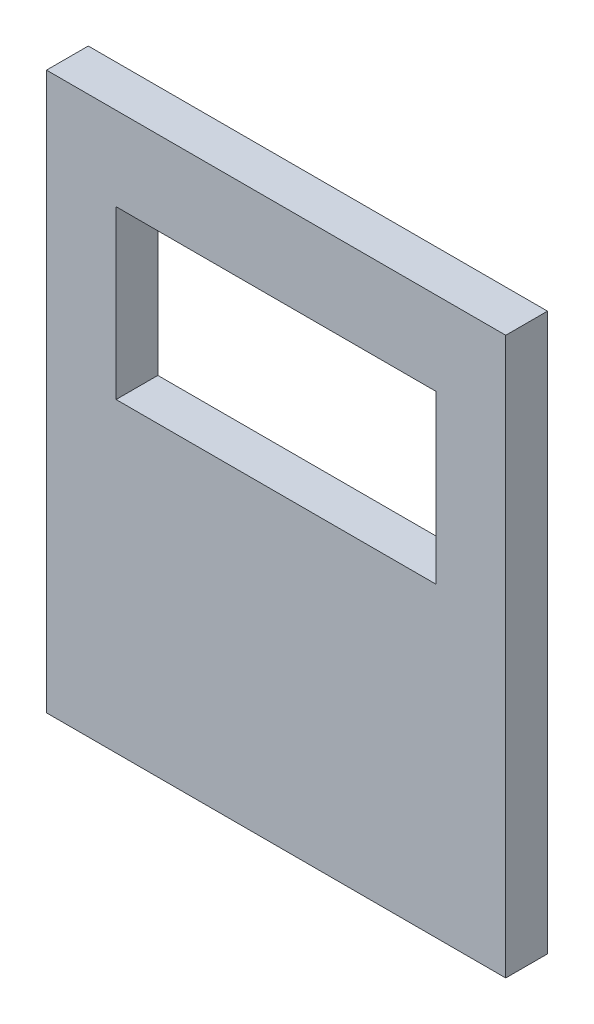
ISO-10303-21;
HEADER;
FILE_DESCRIPTION(('STEP AP214'),'2;1');
FILE_NAME('part.step','',(''),(''),'','','');
FILE_SCHEMA(('AUTOMOTIVE_DESIGN { 1 0 10303 214 1 1 1 1 }'));
ENDSEC;
DATA;
#1=APPLICATION_CONTEXT('core data for automotive mechanical design processes');
#2=APPLICATION_PROTOCOL_DEFINITION('international standard','automotive_design',2000,#1);
#3=PRODUCT_CONTEXT('',#1,'mechanical');
#4=PRODUCT('Part','Part','',(#3));
#5=PRODUCT_RELATED_PRODUCT_CATEGORY('part','',(#4));
#6=PRODUCT_DEFINITION_FORMATION('','',#4);
#7=PRODUCT_DEFINITION_CONTEXT('part definition',#1,'design');
#8=PRODUCT_DEFINITION('design','',#6,#7);
#9=PRODUCT_DEFINITION_SHAPE('','',#8);
#10=(LENGTH_UNIT() NAMED_UNIT(*) SI_UNIT(.MILLI.,.METRE.));
#11=(NAMED_UNIT(*) PLANE_ANGLE_UNIT() SI_UNIT($,.RADIAN.));
#12=(NAMED_UNIT(*) SI_UNIT($,.STERADIAN.) SOLID_ANGLE_UNIT());
#13=UNCERTAINTY_MEASURE_WITH_UNIT(LENGTH_MEASURE(1.E-05),#10,'distance_accuracy_value','');
#14=(GEOMETRIC_REPRESENTATION_CONTEXT(3) GLOBAL_UNCERTAINTY_ASSIGNED_CONTEXT((#13)) GLOBAL_UNIT_ASSIGNED_CONTEXT((#10,
#11,#12)) REPRESENTATION_CONTEXT('',''));
#15=CARTESIAN_POINT('',(0.,0.,0.));
#16=DIRECTION('',(0.,0.,1.));
#17=DIRECTION('',(1.,0.,0.));
#18=AXIS2_PLACEMENT_3D('',#15,#16,#17);
#19=CARTESIAN_POINT('',(0.,0.,3.));
#20=DIRECTION('',(0.,0.,-1.));
#21=DIRECTION('',(-1.,0.,0.));
#22=AXIS2_PLACEMENT_3D('',#19,#20,#21);
#23=PLANE('',#22);
#24=DIRECTION('',(0.,1.,0.));
#25=VECTOR('',#24,1.);
#26=CARTESIAN_POINT('',(16.5,-20.,3.));
#27=LINE('',#26,#25);
#28=CARTESIAN_POINT('',(16.5,-20.,3.));
#29=VERTEX_POINT('',#28);
#30=CARTESIAN_POINT('',(16.5,20.,3.));
#31=VERTEX_POINT('',#30);
#32=EDGE_CURVE('E134',#29,#31,#27,.T.);
#33=ORIENTED_EDGE('',*,*,#32,.T.);
#34=DIRECTION('',(-1.,0.,0.));
#35=VECTOR('',#34,1.);
#36=CARTESIAN_POINT('',(-16.5,20.,3.));
#37=LINE('',#36,#35);
#38=CARTESIAN_POINT('',(-16.5,20.,3.));
#39=VERTEX_POINT('',#38);
#40=EDGE_CURVE('E137',#31,#39,#37,.T.);
#41=ORIENTED_EDGE('',*,*,#40,.T.);
#42=DIRECTION('',(0.,-1.,0.));
#43=VECTOR('',#42,1.);
#44=CARTESIAN_POINT('',(-16.5,-20.,3.));
#45=LINE('',#44,#43);
#46=CARTESIAN_POINT('',(-16.5,-20.,3.));
#47=VERTEX_POINT('',#46);
#48=EDGE_CURVE('E140',#39,#47,#45,.T.);
#49=ORIENTED_EDGE('',*,*,#48,.T.);
#50=DIRECTION('',(1.,0.,0.));
#51=VECTOR('',#50,1.);
#52=CARTESIAN_POINT('',(-16.5,-20.,3.));
#53=LINE('',#52,#51);
#54=EDGE_CURVE('E142',#47,#29,#53,.T.);
#55=ORIENTED_EDGE('',*,*,#54,.T.);
#56=EDGE_LOOP('',(#33,#41,#49,#55));
#57=FACE_BOUND('',#56,.T.);
#58=DIRECTION('',(0.,-1.,0.));
#59=VECTOR('',#58,1.);
#60=CARTESIAN_POINT('',(-11.5,14.,3.));
#61=LINE('',#60,#59);
#62=CARTESIAN_POINT('',(-11.5,14.,3.));
#63=VERTEX_POINT('',#62);
#64=CARTESIAN_POINT('',(-11.5,1.99999999999999,3.));
#65=VERTEX_POINT('',#64);
#66=EDGE_CURVE('E98',#63,#65,#61,.T.);
#67=ORIENTED_EDGE('',*,*,#66,.F.);
#68=DIRECTION('',(-1.,0.,0.));
#69=VECTOR('',#68,1.);
#70=CARTESIAN_POINT('',(-11.5,14.,3.));
#71=LINE('',#70,#69);
#72=CARTESIAN_POINT('',(11.5,14.,3.));
#73=VERTEX_POINT('',#72);
#74=EDGE_CURVE('E120',#73,#63,#71,.T.);
#75=ORIENTED_EDGE('',*,*,#74,.F.);
#76=DIRECTION('',(0.,1.,0.));
#77=VECTOR('',#76,1.);
#78=CARTESIAN_POINT('',(11.5,14.,3.));
#79=LINE('',#78,#77);
#80=CARTESIAN_POINT('',(11.5,1.99999999999999,3.));
#81=VERTEX_POINT('',#80);
#82=EDGE_CURVE('E118',#81,#73,#79,.T.);
#83=ORIENTED_EDGE('',*,*,#82,.F.);
#84=DIRECTION('',(1.,0.,0.));
#85=VECTOR('',#84,1.);
#86=CARTESIAN_POINT('',(-11.5,1.99999999999999,3.));
#87=LINE('',#86,#85);
#88=EDGE_CURVE('E106',#65,#81,#87,.T.);
#89=ORIENTED_EDGE('',*,*,#88,.F.);
#90=EDGE_LOOP('',(#67,#75,#83,#89));
#91=FACE_BOUND('',#90,.T.);
#92=ADVANCED_FACE('F33',(#57,#91),#23,.F.);
#93=CARTESIAN_POINT('',(0.,0.,0.));
#94=DIRECTION('',(0.,0.,-1.));
#95=DIRECTION('',(-1.,0.,0.));
#96=AXIS2_PLACEMENT_3D('',#93,#94,#95);
#97=PLANE('',#96);
#98=DIRECTION('',(0.,1.,0.));
#99=VECTOR('',#98,1.);
#100=CARTESIAN_POINT('',(16.5,-20.,0.));
#101=LINE('',#100,#99);
#102=CARTESIAN_POINT('',(16.5,-20.,0.));
#103=VERTEX_POINT('',#102);
#104=CARTESIAN_POINT('',(16.5,20.,0.));
#105=VERTEX_POINT('',#104);
#106=EDGE_CURVE('E114',#103,#105,#101,.T.);
#107=ORIENTED_EDGE('',*,*,#106,.F.);
#108=DIRECTION('',(1.,0.,0.));
#109=VECTOR('',#108,1.);
#110=CARTESIAN_POINT('',(-16.5,-20.,0.));
#111=LINE('',#110,#109);
#112=CARTESIAN_POINT('',(-16.5,-20.,0.));
#113=VERTEX_POINT('',#112);
#114=EDGE_CURVE('E138',#113,#103,#111,.T.);
#115=ORIENTED_EDGE('',*,*,#114,.F.);
#116=DIRECTION('',(0.,-1.,0.));
#117=VECTOR('',#116,1.);
#118=CARTESIAN_POINT('',(-16.5,-20.,0.));
#119=LINE('',#118,#117);
#120=CARTESIAN_POINT('',(-16.5,20.,0.));
#121=VERTEX_POINT('',#120);
#122=EDGE_CURVE('E149',#121,#113,#119,.T.);
#123=ORIENTED_EDGE('',*,*,#122,.F.);
#124=DIRECTION('',(-1.,0.,0.));
#125=VECTOR('',#124,1.);
#126=CARTESIAN_POINT('',(-16.5,20.,0.));
#127=LINE('',#126,#125);
#128=EDGE_CURVE('E147',#105,#121,#127,.T.);
#129=ORIENTED_EDGE('',*,*,#128,.F.);
#130=EDGE_LOOP('',(#107,#115,#123,#129));
#131=FACE_BOUND('',#130,.T.);
#132=DIRECTION('',(-1.,0.,0.));
#133=VECTOR('',#132,1.);
#134=CARTESIAN_POINT('',(-11.5,14.,0.));
#135=LINE('',#134,#133);
#136=CARTESIAN_POINT('',(11.5,14.,0.));
#137=VERTEX_POINT('',#136);
#138=CARTESIAN_POINT('',(-11.5,14.,0.));
#139=VERTEX_POINT('',#138);
#140=EDGE_CURVE('E107',#137,#139,#135,.T.);
#141=ORIENTED_EDGE('',*,*,#140,.T.);
#142=DIRECTION('',(0.,-1.,0.));
#143=VECTOR('',#142,1.);
#144=CARTESIAN_POINT('',(-11.5,14.,0.));
#145=LINE('',#144,#143);
#146=CARTESIAN_POINT('',(-11.5,1.99999999999999,0.));
#147=VERTEX_POINT('',#146);
#148=EDGE_CURVE('E56',#139,#147,#145,.T.);
#149=ORIENTED_EDGE('',*,*,#148,.T.);
#150=DIRECTION('',(1.,0.,0.));
#151=VECTOR('',#150,1.);
#152=CARTESIAN_POINT('',(-11.5,1.99999999999999,0.));
#153=LINE('',#152,#151);
#154=CARTESIAN_POINT('',(11.5,1.99999999999999,0.));
#155=VERTEX_POINT('',#154);
#156=EDGE_CURVE('E113',#147,#155,#153,.T.);
#157=ORIENTED_EDGE('',*,*,#156,.T.);
#158=DIRECTION('',(0.,1.,0.));
#159=VECTOR('',#158,1.);
#160=CARTESIAN_POINT('',(11.5,14.,0.));
#161=LINE('',#160,#159);
#162=EDGE_CURVE('E126',#155,#137,#161,.T.);
#163=ORIENTED_EDGE('',*,*,#162,.T.);
#164=EDGE_LOOP('',(#141,#149,#157,#163));
#165=FACE_BOUND('',#164,.T.);
#166=ADVANCED_FACE('F167',(#131,#165),#97,.T.);
#167=CARTESIAN_POINT('',(16.5,-20.,3.));
#168=DIRECTION('',(-1.,0.,0.));
#169=DIRECTION('',(0.,0.,1.));
#170=AXIS2_PLACEMENT_3D('',#167,#168,#169);
#171=PLANE('',#170);
#172=ORIENTED_EDGE('',*,*,#106,.T.);
#173=DIRECTION('',(0.,0.,-1.));
#174=VECTOR('',#173,1.);
#175=CARTESIAN_POINT('',(16.5,20.,3.));
#176=LINE('',#175,#174);
#177=EDGE_CURVE('E11',#31,#105,#176,.T.);
#178=ORIENTED_EDGE('',*,*,#177,.F.);
#179=ORIENTED_EDGE('',*,*,#32,.F.);
#180=DIRECTION('',(0.,0.,-1.));
#181=VECTOR('',#180,1.);
#182=CARTESIAN_POINT('',(16.5,-20.,3.));
#183=LINE('',#182,#181);
#184=EDGE_CURVE('E144',#29,#103,#183,.T.);
#185=ORIENTED_EDGE('',*,*,#184,.T.);
#186=EDGE_LOOP('',(#172,#178,#179,#185));
#187=FACE_BOUND('',#186,.T.);
#188=ADVANCED_FACE('F35',(#187),#171,.F.);
#189=CARTESIAN_POINT('',(-16.5,20.,3.));
#190=DIRECTION('',(0.,-1.,0.));
#191=DIRECTION('',(0.,0.,-1.));
#192=AXIS2_PLACEMENT_3D('',#189,#190,#191);
#193=PLANE('',#192);
#194=ORIENTED_EDGE('',*,*,#128,.T.);
#195=DIRECTION('',(0.,0.,-1.));
#196=VECTOR('',#195,1.);
#197=CARTESIAN_POINT('',(-16.5,20.,3.));
#198=LINE('',#197,#196);
#199=EDGE_CURVE('E41',#39,#121,#198,.T.);
#200=ORIENTED_EDGE('',*,*,#199,.F.);
#201=ORIENTED_EDGE('',*,*,#40,.F.);
#202=ORIENTED_EDGE('',*,*,#177,.T.);
#203=EDGE_LOOP('',(#194,#200,#201,#202));
#204=FACE_BOUND('',#203,.T.);
#205=ADVANCED_FACE('F177',(#204),#193,.F.);
#206=CARTESIAN_POINT('',(-16.5,-20.,3.));
#207=DIRECTION('',(1.,0.,0.));
#208=DIRECTION('',(0.,0.,-1.));
#209=AXIS2_PLACEMENT_3D('',#206,#207,#208);
#210=PLANE('',#209);
#211=ORIENTED_EDGE('',*,*,#122,.T.);
#212=DIRECTION('',(0.,0.,-1.));
#213=VECTOR('',#212,1.);
#214=CARTESIAN_POINT('',(-16.5,-20.,3.));
#215=LINE('',#214,#213);
#216=EDGE_CURVE('E154',#47,#113,#215,.T.);
#217=ORIENTED_EDGE('',*,*,#216,.F.);
#218=ORIENTED_EDGE('',*,*,#48,.F.);
#219=ORIENTED_EDGE('',*,*,#199,.T.);
#220=EDGE_LOOP('',(#211,#217,#218,#219));
#221=FACE_BOUND('',#220,.T.);
#222=ADVANCED_FACE('F161',(#221),#210,.F.);
#223=CARTESIAN_POINT('',(-16.5,-20.,3.));
#224=DIRECTION('',(0.,1.,0.));
#225=DIRECTION('',(0.,0.,1.));
#226=AXIS2_PLACEMENT_3D('',#223,#224,#225);
#227=PLANE('',#226);
#228=ORIENTED_EDGE('',*,*,#114,.T.);
#229=ORIENTED_EDGE('',*,*,#184,.F.);
#230=ORIENTED_EDGE('',*,*,#54,.F.);
#231=ORIENTED_EDGE('',*,*,#216,.T.);
#232=EDGE_LOOP('',(#228,#229,#230,#231));
#233=FACE_BOUND('',#232,.T.);
#234=ADVANCED_FACE('F171',(#233),#227,.F.);
#235=CARTESIAN_POINT('',(-11.5,14.,3.));
#236=DIRECTION('',(1.,0.,0.));
#237=DIRECTION('',(0.,0.,-1.));
#238=AXIS2_PLACEMENT_3D('',#235,#236,#237);
#239=PLANE('',#238);
#240=ORIENTED_EDGE('',*,*,#148,.F.);
#241=DIRECTION('',(0.,0.,-1.));
#242=VECTOR('',#241,1.);
#243=CARTESIAN_POINT('',(-11.5,14.,3.));
#244=LINE('',#243,#242);
#245=EDGE_CURVE('E102',#63,#139,#244,.T.);
#246=ORIENTED_EDGE('',*,*,#245,.F.);
#247=ORIENTED_EDGE('',*,*,#66,.T.);
#248=DIRECTION('',(0.,0.,-1.));
#249=VECTOR('',#248,1.);
#250=CARTESIAN_POINT('',(-11.5,1.99999999999999,3.));
#251=LINE('',#250,#249);
#252=EDGE_CURVE('E101',#65,#147,#251,.T.);
#253=ORIENTED_EDGE('',*,*,#252,.T.);
#254=EDGE_LOOP('',(#240,#246,#247,#253));
#255=FACE_BOUND('',#254,.T.);
#256=ADVANCED_FACE('F100',(#255),#239,.T.);
#257=CARTESIAN_POINT('',(-11.5,1.99999999999999,3.));
#258=DIRECTION('',(0.,1.,0.));
#259=DIRECTION('',(0.,0.,1.));
#260=AXIS2_PLACEMENT_3D('',#257,#258,#259);
#261=PLANE('',#260);
#262=ORIENTED_EDGE('',*,*,#156,.F.);
#263=ORIENTED_EDGE('',*,*,#252,.F.);
#264=ORIENTED_EDGE('',*,*,#88,.T.);
#265=DIRECTION('',(0.,0.,-1.));
#266=VECTOR('',#265,1.);
#267=CARTESIAN_POINT('',(11.5,1.99999999999999,3.));
#268=LINE('',#267,#266);
#269=EDGE_CURVE('E115',#81,#155,#268,.T.);
#270=ORIENTED_EDGE('',*,*,#269,.T.);
#271=EDGE_LOOP('',(#262,#263,#264,#270));
#272=FACE_BOUND('',#271,.T.);
#273=ADVANCED_FACE('F110',(#272),#261,.T.);
#274=CARTESIAN_POINT('',(11.5,14.,3.));
#275=DIRECTION('',(-1.,0.,0.));
#276=DIRECTION('',(0.,-1.,0.));
#277=AXIS2_PLACEMENT_3D('',#274,#275,#276);
#278=PLANE('',#277);
#279=ORIENTED_EDGE('',*,*,#162,.F.);
#280=ORIENTED_EDGE('',*,*,#269,.F.);
#281=ORIENTED_EDGE('',*,*,#82,.T.);
#282=DIRECTION('',(0.,0.,-1.));
#283=VECTOR('',#282,1.);
#284=CARTESIAN_POINT('',(11.5,14.,3.));
#285=LINE('',#284,#283);
#286=EDGE_CURVE('E48',#73,#137,#285,.T.);
#287=ORIENTED_EDGE('',*,*,#286,.T.);
#288=EDGE_LOOP('',(#279,#280,#281,#287));
#289=FACE_BOUND('',#288,.T.);
#290=ADVANCED_FACE('F200',(#289),#278,.T.);
#291=CARTESIAN_POINT('',(-11.5,14.,3.));
#292=DIRECTION('',(0.,-1.,0.));
#293=DIRECTION('',(0.,0.,-1.));
#294=AXIS2_PLACEMENT_3D('',#291,#292,#293);
#295=PLANE('',#294);
#296=ORIENTED_EDGE('',*,*,#140,.F.);
#297=ORIENTED_EDGE('',*,*,#286,.F.);
#298=ORIENTED_EDGE('',*,*,#74,.T.);
#299=ORIENTED_EDGE('',*,*,#245,.T.);
#300=EDGE_LOOP('',(#296,#297,#298,#299));
#301=FACE_BOUND('',#300,.T.);
#302=ADVANCED_FACE('F204',(#301),#295,.T.);
#303=CLOSED_SHELL('',(#92,#166,#188,#205,#222,#234,#256,#273,#290,#302));
#304=MANIFOLD_SOLID_BREP('B2',#303);
#305=ADVANCED_BREP_SHAPE_REPRESENTATION('',(#18,#304),#14);
#306=SHAPE_DEFINITION_REPRESENTATION(#9,#305);
ENDSEC;
END-ISO-10303-21;
